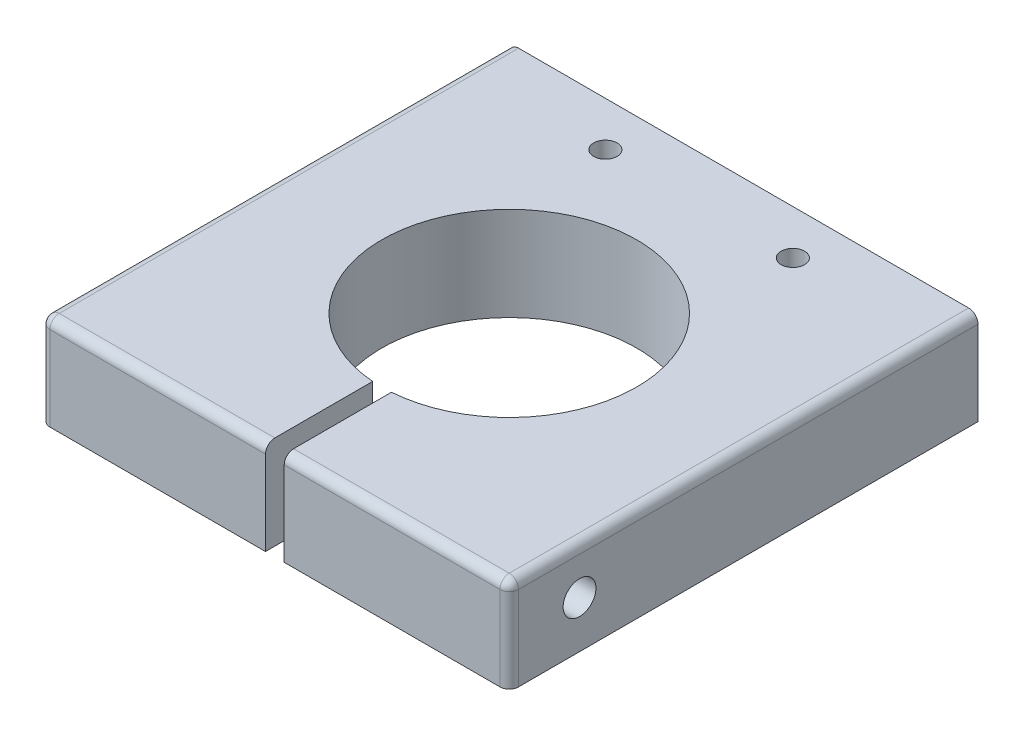
ISO-10303-21;
HEADER;
FILE_DESCRIPTION(('STEP AP214'),'2;1');
FILE_NAME('part.step','',(''),(''),'','','');
FILE_SCHEMA(('AUTOMOTIVE_DESIGN { 1 0 10303 214 1 1 1 1 }'));
ENDSEC;
DATA;
#1=APPLICATION_CONTEXT('core data for automotive mechanical design processes');
#2=APPLICATION_PROTOCOL_DEFINITION('international standard','automotive_design',2000,#1);
#3=PRODUCT_CONTEXT('',#1,'mechanical');
#4=PRODUCT('Part','Part','',(#3));
#5=PRODUCT_RELATED_PRODUCT_CATEGORY('part','',(#4));
#6=PRODUCT_DEFINITION_FORMATION('','',#4);
#7=PRODUCT_DEFINITION_CONTEXT('part definition',#1,'design');
#8=PRODUCT_DEFINITION('design','',#6,#7);
#9=PRODUCT_DEFINITION_SHAPE('','',#8);
#10=(LENGTH_UNIT() NAMED_UNIT(*) SI_UNIT(.MILLI.,.METRE.));
#11=(NAMED_UNIT(*) PLANE_ANGLE_UNIT() SI_UNIT($,.RADIAN.));
#12=(NAMED_UNIT(*) SI_UNIT($,.STERADIAN.) SOLID_ANGLE_UNIT());
#13=UNCERTAINTY_MEASURE_WITH_UNIT(LENGTH_MEASURE(1.E-05),#10,'distance_accuracy_value','');
#14=(GEOMETRIC_REPRESENTATION_CONTEXT(3) GLOBAL_UNCERTAINTY_ASSIGNED_CONTEXT((#13)) GLOBAL_UNIT_ASSIGNED_CONTEXT((#10,
#11,#12)) REPRESENTATION_CONTEXT('',''));
#15=CARTESIAN_POINT('',(0.,0.,0.));
#16=DIRECTION('',(0.,0.,1.));
#17=DIRECTION('',(1.,0.,0.));
#18=AXIS2_PLACEMENT_3D('',#15,#16,#17);
#19=CARTESIAN_POINT('',(2.00000000000002,20.,100.));
#20=DIRECTION('',(1.,0.,0.));
#21=DIRECTION('',(0.,0.,-1.));
#22=AXIS2_PLACEMENT_3D('',#19,#20,#21);
#23=PLANE('',#22);
#24=CARTESIAN_POINT('',(2.00000000000002,10.,85.));
#25=DIRECTION('',(1.,0.,0.));
#26=DIRECTION('',(0.,0.,-1.));
#27=AXIS2_PLACEMENT_3D('',#24,#25,#26);
#28=CIRCLE('',#27,3.50000000000002);
#29=CARTESIAN_POINT('',(2.00000000000002,10.,81.5));
#30=VERTEX_POINT('',#29);
#31=EDGE_CURVE('E179',#30,#30,#28,.T.);
#32=ORIENTED_EDGE('',*,*,#31,.T.);
#33=EDGE_LOOP('',(#32));
#34=FACE_BOUND('',#33,.T.);
#35=DIRECTION('',(0.,-1.,0.));
#36=VECTOR('',#35,1.);
#37=CARTESIAN_POINT('',(2.00000000000002,20.,100.));
#38=LINE('',#37,#36);
#39=CARTESIAN_POINT('',(2.00000000000002,18.,100.));
#40=VERTEX_POINT('',#39);
#41=CARTESIAN_POINT('',(2.00000000000002,0.,100.));
#42=VERTEX_POINT('',#41);
#43=EDGE_CURVE('E171',#40,#42,#38,.T.);
#44=ORIENTED_EDGE('',*,*,#43,.F.);
#45=CARTESIAN_POINT('',(2.00000000000002,18.,98.));
#46=DIRECTION('',(1.,0.,0.));
#47=DIRECTION('',(0.,0.,-1.));
#48=AXIS2_PLACEMENT_3D('',#45,#46,#47);
#49=CIRCLE('',#48,2.);
#50=CARTESIAN_POINT('',(2.00000000000002,20.,98.));
#51=VERTEX_POINT('',#50);
#52=EDGE_CURVE('E42',#40,#51,#49,.F.);
#53=ORIENTED_EDGE('',*,*,#52,.T.);
#54=DIRECTION('',(0.,0.,1.));
#55=VECTOR('',#54,1.);
#56=CARTESIAN_POINT('',(2.00000000000002,20.,100.));
#57=LINE('',#56,#55);
#58=CARTESIAN_POINT('',(2.00000000000002,20.,77.1263709330976));
#59=VERTEX_POINT('',#58);
#60=EDGE_CURVE('E144',#59,#51,#57,.T.);
#61=ORIENTED_EDGE('',*,*,#60,.F.);
#62=DIRECTION('',(0.,1.,0.));
#63=VECTOR('',#62,1.);
#64=CARTESIAN_POINT('',(2.00000000000002,0.,77.1263709330976));
#65=LINE('',#64,#63);
#66=CARTESIAN_POINT('',(2.00000000000002,0.,77.1263709330976));
#67=VERTEX_POINT('',#66);
#68=EDGE_CURVE('E129',#59,#67,#65,.F.);
#69=ORIENTED_EDGE('',*,*,#68,.T.);
#70=DIRECTION('',(0.,0.,1.));
#71=VECTOR('',#70,1.);
#72=CARTESIAN_POINT('',(2.00000000000002,0.,100.));
#73=LINE('',#72,#71);
#74=EDGE_CURVE('E163',#67,#42,#73,.T.);
#75=ORIENTED_EDGE('',*,*,#74,.T.);
#76=EDGE_LOOP('',(#44,#53,#61,#69,#75));
#77=FACE_BOUND('',#76,.T.);
#78=ADVANCED_FACE('F33',(#34,#77),#23,.F.);
#79=CARTESIAN_POINT('',(50.,20.,100.));
#80=DIRECTION('',(0.,0.,-1.));
#81=DIRECTION('',(-1.,0.,0.));
#82=AXIS2_PLACEMENT_3D('',#79,#80,#81);
#83=PLANE('',#82);
#84=DIRECTION('',(1.,0.,0.));
#85=VECTOR('',#84,1.);
#86=CARTESIAN_POINT('',(50.,0.,100.));
#87=LINE('',#86,#85);
#88=CARTESIAN_POINT('',(48.,0.,100.));
#89=VERTEX_POINT('',#88);
#90=EDGE_CURVE('E165',#42,#89,#87,.T.);
#91=ORIENTED_EDGE('',*,*,#90,.T.);
#92=DIRECTION('',(0.,-1.,0.));
#93=VECTOR('',#92,1.);
#94=CARTESIAN_POINT('',(48.,20.,100.));
#95=LINE('',#94,#93);
#96=CARTESIAN_POINT('',(48.,18.,100.));
#97=VERTEX_POINT('',#96);
#98=EDGE_CURVE('E191',#89,#97,#95,.F.);
#99=ORIENTED_EDGE('',*,*,#98,.T.);
#100=DIRECTION('',(1.,0.,0.));
#101=VECTOR('',#100,1.);
#102=CARTESIAN_POINT('',(50.,18.,100.));
#103=LINE('',#102,#101);
#104=EDGE_CURVE('E189',#97,#40,#103,.F.);
#105=ORIENTED_EDGE('',*,*,#104,.T.);
#106=ORIENTED_EDGE('',*,*,#43,.T.);
#107=EDGE_LOOP('',(#91,#99,#105,#106));
#108=FACE_BOUND('',#107,.T.);
#109=ADVANCED_FACE('F300',(#108),#83,.F.);
#110=CARTESIAN_POINT('',(50.,20.,0.));
#111=DIRECTION('',(-1.,0.,0.));
#112=DIRECTION('',(0.,0.,1.));
#113=AXIS2_PLACEMENT_3D('',#110,#111,#112);
#114=PLANE('',#113);
#115=CARTESIAN_POINT('',(50.,10.,85.));
#116=DIRECTION('',(1.,0.,0.));
#117=DIRECTION('',(0.,0.,-1.));
#118=AXIS2_PLACEMENT_3D('',#115,#116,#117);
#119=CIRCLE('',#118,3.50000000000002);
#120=CARTESIAN_POINT('',(50.,10.,81.5));
#121=VERTEX_POINT('',#120);
#122=EDGE_CURVE('E222',#121,#121,#119,.T.);
#123=ORIENTED_EDGE('',*,*,#122,.F.);
#124=EDGE_LOOP('',(#123));
#125=FACE_BOUND('',#124,.T.);
#126=DIRECTION('',(0.,0.,-1.));
#127=VECTOR('',#126,1.);
#128=CARTESIAN_POINT('',(50.,18.,0.));
#129=LINE('',#128,#127);
#130=CARTESIAN_POINT('',(50.,18.,0.));
#131=VERTEX_POINT('',#130);
#132=CARTESIAN_POINT('',(50.,18.,98.));
#133=VERTEX_POINT('',#132);
#134=EDGE_CURVE('E175',#131,#133,#129,.F.);
#135=ORIENTED_EDGE('',*,*,#134,.T.);
#136=DIRECTION('',(0.,-1.,0.));
#137=VECTOR('',#136,1.);
#138=CARTESIAN_POINT('',(50.,20.,98.));
#139=LINE('',#138,#137);
#140=CARTESIAN_POINT('',(50.,0.,98.));
#141=VERTEX_POINT('',#140);
#142=EDGE_CURVE('E182',#133,#141,#139,.T.);
#143=ORIENTED_EDGE('',*,*,#142,.T.);
#144=DIRECTION('',(0.,0.,-1.));
#145=VECTOR('',#144,1.);
#146=CARTESIAN_POINT('',(50.,0.,0.));
#147=LINE('',#146,#145);
#148=CARTESIAN_POINT('',(50.,0.,0.));
#149=VERTEX_POINT('',#148);
#150=EDGE_CURVE('E157',#141,#149,#147,.T.);
#151=ORIENTED_EDGE('',*,*,#150,.T.);
#152=DIRECTION('',(0.,-1.,0.));
#153=VECTOR('',#152,1.);
#154=CARTESIAN_POINT('',(50.,20.,0.));
#155=LINE('',#154,#153);
#156=EDGE_CURVE('E154',#131,#149,#155,.T.);
#157=ORIENTED_EDGE('',*,*,#156,.F.);
#158=EDGE_LOOP('',(#135,#143,#151,#157));
#159=FACE_BOUND('',#158,.T.);
#160=ADVANCED_FACE('F306',(#125,#159),#114,.F.);
#161=CARTESIAN_POINT('',(0.,20.,0.));
#162=DIRECTION('',(0.,0.,1.));
#163=DIRECTION('',(1.,0.,0.));
#164=AXIS2_PLACEMENT_3D('',#161,#162,#163);
#165=PLANE('',#164);
#166=DIRECTION('',(-1.,0.,0.));
#167=VECTOR('',#166,1.);
#168=CARTESIAN_POINT('',(0.,20.,0.));
#169=LINE('',#168,#167);
#170=CARTESIAN_POINT('',(48.,20.,0.));
#171=VERTEX_POINT('',#170);
#172=CARTESIAN_POINT('',(-48.,20.,0.));
#173=VERTEX_POINT('',#172);
#174=EDGE_CURVE('E151',#171,#173,#169,.T.);
#175=ORIENTED_EDGE('',*,*,#174,.F.);
#176=CARTESIAN_POINT('',(48.,18.,0.));
#177=DIRECTION('',(0.,0.,1.));
#178=DIRECTION('',(1.,0.,0.));
#179=AXIS2_PLACEMENT_3D('',#176,#177,#178);
#180=CIRCLE('',#179,2.);
#181=EDGE_CURVE('E210',#171,#131,#180,.F.);
#182=ORIENTED_EDGE('',*,*,#181,.T.);
#183=ORIENTED_EDGE('',*,*,#156,.T.);
#184=DIRECTION('',(-1.,0.,0.));
#185=VECTOR('',#184,1.);
#186=CARTESIAN_POINT('',(0.,0.,0.));
#187=LINE('',#186,#185);
#188=CARTESIAN_POINT('',(-50.,0.,0.));
#189=VERTEX_POINT('',#188);
#190=EDGE_CURVE('E152',#149,#189,#187,.T.);
#191=ORIENTED_EDGE('',*,*,#190,.T.);
#192=DIRECTION('',(0.,-1.,0.));
#193=VECTOR('',#192,1.);
#194=CARTESIAN_POINT('',(-50.,20.,0.));
#195=LINE('',#194,#193);
#196=CARTESIAN_POINT('',(-50.,18.,0.));
#197=VERTEX_POINT('',#196);
#198=EDGE_CURVE('E160',#197,#189,#195,.T.);
#199=ORIENTED_EDGE('',*,*,#198,.F.);
#200=CARTESIAN_POINT('',(-48.,18.,0.));
#201=DIRECTION('',(0.,0.,1.));
#202=DIRECTION('',(1.,0.,0.));
#203=AXIS2_PLACEMENT_3D('',#200,#201,#202);
#204=CIRCLE('',#203,2.);
#205=EDGE_CURVE('E208',#197,#173,#204,.F.);
#206=ORIENTED_EDGE('',*,*,#205,.T.);
#207=EDGE_LOOP('',(#175,#182,#183,#191,#199,#206));
#208=FACE_BOUND('',#207,.T.);
#209=ADVANCED_FACE('F352',(#208),#165,.F.);
#210=CARTESIAN_POINT('',(0.,20.,0.));
#211=DIRECTION('',(0.,-1.,0.));
#212=DIRECTION('',(0.,0.,-1.));
#213=AXIS2_PLACEMENT_3D('',#210,#211,#212);
#214=PLANE('',#213);
#215=CARTESIAN_POINT('',(-20.,20.,9.50000000000001));
#216=DIRECTION('',(0.,-1.,0.));
#217=DIRECTION('',(0.,0.,1.));
#218=AXIS2_PLACEMENT_3D('',#215,#216,#217);
#219=CIRCLE('',#218,2.5);
#220=CARTESIAN_POINT('',(-20.,20.,12.));
#221=VERTEX_POINT('',#220);
#222=EDGE_CURVE('E269',#221,#221,#219,.T.);
#223=ORIENTED_EDGE('',*,*,#222,.T.);
#224=EDGE_LOOP('',(#223));
#225=FACE_BOUND('',#224,.T.);
#226=CARTESIAN_POINT('',(20.,20.,9.50000000000001));
#227=DIRECTION('',(0.,1.,0.));
#228=DIRECTION('',(0.,0.,1.));
#229=AXIS2_PLACEMENT_3D('',#226,#227,#228);
#230=CIRCLE('',#229,2.5);
#231=CARTESIAN_POINT('',(20.,20.,12.));
#232=VERTEX_POINT('',#231);
#233=EDGE_CURVE('E263',#232,#232,#230,.T.);
#234=ORIENTED_EDGE('',*,*,#233,.F.);
#235=EDGE_LOOP('',(#234));
#236=FACE_BOUND('',#235,.T.);
#237=DIRECTION('',(1.,0.,0.));
#238=VECTOR('',#237,1.);
#239=CARTESIAN_POINT('',(0.,20.,98.));
#240=LINE('',#239,#238);
#241=CARTESIAN_POINT('',(48.,20.,98.));
#242=VERTEX_POINT('',#241);
#243=EDGE_CURVE('E50',#51,#242,#240,.T.);
#244=ORIENTED_EDGE('',*,*,#243,.T.);
#245=DIRECTION('',(0.,0.,-1.));
#246=VECTOR('',#245,1.);
#247=CARTESIAN_POINT('',(48.,20.,0.));
#248=LINE('',#247,#246);
#249=EDGE_CURVE('E206',#242,#171,#248,.T.);
#250=ORIENTED_EDGE('',*,*,#249,.T.);
#251=ORIENTED_EDGE('',*,*,#174,.T.);
#252=DIRECTION('',(0.,0.,-1.));
#253=VECTOR('',#252,1.);
#254=CARTESIAN_POINT('',(-48.,20.,100.));
#255=LINE('',#254,#253);
#256=CARTESIAN_POINT('',(-48.,20.,98.));
#257=VERTEX_POINT('',#256);
#258=EDGE_CURVE('E57',#173,#257,#255,.F.);
#259=ORIENTED_EDGE('',*,*,#258,.T.);
#260=DIRECTION('',(-1.,0.,0.));
#261=VECTOR('',#260,1.);
#262=CARTESIAN_POINT('',(-2.00000000000002,20.,98.));
#263=LINE('',#262,#261);
#264=CARTESIAN_POINT('',(-2.00000000000002,20.,98.));
#265=VERTEX_POINT('',#264);
#266=EDGE_CURVE('E202',#257,#265,#263,.F.);
#267=ORIENTED_EDGE('',*,*,#266,.T.);
#268=DIRECTION('',(0.,0.,1.));
#269=VECTOR('',#268,1.);
#270=CARTESIAN_POINT('',(-2.00000000000002,20.,100.));
#271=LINE('',#270,#269);
#272=CARTESIAN_POINT('',(-2.00000000000002,20.,77.1263709330976));
#273=VERTEX_POINT('',#272);
#274=EDGE_CURVE('E146',#273,#265,#271,.T.);
#275=ORIENTED_EDGE('',*,*,#274,.F.);
#276=CARTESIAN_POINT('',(0.,20.,50.));
#277=DIRECTION('',(0.,1.,0.));
#278=DIRECTION('',(0.,0.,1.));
#279=AXIS2_PLACEMENT_3D('',#276,#277,#278);
#280=CIRCLE('',#279,27.2);
#281=EDGE_CURVE('E132',#59,#273,#280,.T.);
#282=ORIENTED_EDGE('',*,*,#281,.F.);
#283=ORIENTED_EDGE('',*,*,#60,.T.);
#284=EDGE_LOOP('',(#244,#250,#251,#259,#267,#275,#282,#283));
#285=FACE_BOUND('',#284,.T.);
#286=ADVANCED_FACE('F143',(#225,#236,#285),#214,.F.);
#287=CARTESIAN_POINT('',(0.,0.,0.));
#288=DIRECTION('',(0.,-1.,0.));
#289=DIRECTION('',(0.,0.,-1.));
#290=AXIS2_PLACEMENT_3D('',#287,#288,#289);
#291=PLANE('',#290);
#292=CARTESIAN_POINT('',(-20.,0.,9.50000000000001));
#293=DIRECTION('',(0.,-1.,0.));
#294=DIRECTION('',(0.,0.,1.));
#295=AXIS2_PLACEMENT_3D('',#292,#293,#294);
#296=CIRCLE('',#295,2.5);
#297=CARTESIAN_POINT('',(-20.,0.,12.));
#298=VERTEX_POINT('',#297);
#299=EDGE_CURVE('E266',#298,#298,#296,.T.);
#300=ORIENTED_EDGE('',*,*,#299,.F.);
#301=EDGE_LOOP('',(#300));
#302=FACE_BOUND('',#301,.T.);
#303=CARTESIAN_POINT('',(20.,0.,9.50000000000001));
#304=DIRECTION('',(0.,1.,0.));
#305=DIRECTION('',(0.,0.,1.));
#306=AXIS2_PLACEMENT_3D('',#303,#304,#305);
#307=CIRCLE('',#306,2.5);
#308=CARTESIAN_POINT('',(20.,0.,12.));
#309=VERTEX_POINT('',#308);
#310=EDGE_CURVE('E147',#309,#309,#307,.T.);
#311=ORIENTED_EDGE('',*,*,#310,.T.);
#312=EDGE_LOOP('',(#311));
#313=FACE_BOUND('',#312,.T.);
#314=ORIENTED_EDGE('',*,*,#150,.F.);
#315=CARTESIAN_POINT('',(48.,0.,98.));
#316=DIRECTION('',(0.,-1.,0.));
#317=DIRECTION('',(0.,0.,-1.));
#318=AXIS2_PLACEMENT_3D('',#315,#316,#317);
#319=CIRCLE('',#318,2.);
#320=EDGE_CURVE('E187',#141,#89,#319,.T.);
#321=ORIENTED_EDGE('',*,*,#320,.T.);
#322=ORIENTED_EDGE('',*,*,#90,.F.);
#323=ORIENTED_EDGE('',*,*,#74,.F.);
#324=CARTESIAN_POINT('',(0.,0.,50.));
#325=DIRECTION('',(0.,1.,0.));
#326=DIRECTION('',(0.,0.,1.));
#327=AXIS2_PLACEMENT_3D('',#324,#325,#326);
#328=CIRCLE('',#327,27.2);
#329=CARTESIAN_POINT('',(-2.00000000000002,0.,77.1263709330976));
#330=VERTEX_POINT('',#329);
#331=EDGE_CURVE('E135',#67,#330,#328,.T.);
#332=ORIENTED_EDGE('',*,*,#331,.T.);
#333=DIRECTION('',(0.,0.,1.));
#334=VECTOR('',#333,1.);
#335=CARTESIAN_POINT('',(-2.00000000000002,0.,100.));
#336=LINE('',#335,#334);
#337=CARTESIAN_POINT('',(-2.00000000000002,0.,100.));
#338=VERTEX_POINT('',#337);
#339=EDGE_CURVE('E253',#330,#338,#336,.T.);
#340=ORIENTED_EDGE('',*,*,#339,.T.);
#341=DIRECTION('',(-1.,0.,0.));
#342=VECTOR('',#341,1.);
#343=CARTESIAN_POINT('',(-50.,0.,100.));
#344=LINE('',#343,#342);
#345=CARTESIAN_POINT('',(-48.,0.,100.));
#346=VERTEX_POINT('',#345);
#347=EDGE_CURVE('E244',#338,#346,#344,.T.);
#348=ORIENTED_EDGE('',*,*,#347,.T.);
#349=CARTESIAN_POINT('',(-48.,0.,98.));
#350=DIRECTION('',(0.,-1.,0.));
#351=DIRECTION('',(0.,0.,-1.));
#352=AXIS2_PLACEMENT_3D('',#349,#350,#351);
#353=CIRCLE('',#352,2.);
#354=CARTESIAN_POINT('',(-50.,0.,98.));
#355=VERTEX_POINT('',#354);
#356=EDGE_CURVE('E185',#346,#355,#353,.T.);
#357=ORIENTED_EDGE('',*,*,#356,.T.);
#358=DIRECTION('',(0.,0.,-1.));
#359=VECTOR('',#358,1.);
#360=CARTESIAN_POINT('',(-50.,0.,0.));
#361=LINE('',#360,#359);
#362=EDGE_CURVE('E140',#355,#189,#361,.T.);
#363=ORIENTED_EDGE('',*,*,#362,.T.);
#364=ORIENTED_EDGE('',*,*,#190,.F.);
#365=EDGE_LOOP('',(#314,#321,#322,#323,#332,#340,#348,#357,#363,#364));
#366=FACE_BOUND('',#365,.T.);
#367=ADVANCED_FACE('F249',(#302,#313,#366),#291,.T.);
#368=CARTESIAN_POINT('',(-50.,20.,0.));
#369=DIRECTION('',(-1.,0.,0.));
#370=DIRECTION('',(0.,0.,1.));
#371=AXIS2_PLACEMENT_3D('',#368,#369,#370);
#372=PLANE('',#371);
#373=CARTESIAN_POINT('',(-50.,10.,85.));
#374=DIRECTION('',(1.,0.,0.));
#375=DIRECTION('',(0.,0.,-1.));
#376=AXIS2_PLACEMENT_3D('',#373,#374,#375);
#377=CIRCLE('',#376,3.50000000000002);
#378=CARTESIAN_POINT('',(-50.,10.,81.5));
#379=VERTEX_POINT('',#378);
#380=EDGE_CURVE('E180',#379,#379,#377,.T.);
#381=ORIENTED_EDGE('',*,*,#380,.T.);
#382=EDGE_LOOP('',(#381));
#383=FACE_BOUND('',#382,.T.);
#384=ORIENTED_EDGE('',*,*,#362,.F.);
#385=DIRECTION('',(0.,-1.,0.));
#386=VECTOR('',#385,1.);
#387=CARTESIAN_POINT('',(-50.,20.,98.));
#388=LINE('',#387,#386);
#389=CARTESIAN_POINT('',(-50.,18.,98.));
#390=VERTEX_POINT('',#389);
#391=EDGE_CURVE('E200',#355,#390,#388,.F.);
#392=ORIENTED_EDGE('',*,*,#391,.T.);
#393=DIRECTION('',(0.,0.,-1.));
#394=VECTOR('',#393,1.);
#395=CARTESIAN_POINT('',(-50.,18.,0.));
#396=LINE('',#395,#394);
#397=EDGE_CURVE('E198',#390,#197,#396,.T.);
#398=ORIENTED_EDGE('',*,*,#397,.T.);
#399=ORIENTED_EDGE('',*,*,#198,.T.);
#400=EDGE_LOOP('',(#384,#392,#398,#399));
#401=FACE_BOUND('',#400,.T.);
#402=ADVANCED_FACE('F281',(#383,#401),#372,.T.);
#403=CARTESIAN_POINT('',(-50.,20.,100.));
#404=DIRECTION('',(0.,0.,1.));
#405=DIRECTION('',(1.,0.,0.));
#406=AXIS2_PLACEMENT_3D('',#403,#404,#405);
#407=PLANE('',#406);
#408=DIRECTION('',(-1.,0.,0.));
#409=VECTOR('',#408,1.);
#410=CARTESIAN_POINT('',(-50.,18.,100.));
#411=LINE('',#410,#409);
#412=CARTESIAN_POINT('',(-2.00000000000002,18.,100.));
#413=VERTEX_POINT('',#412);
#414=CARTESIAN_POINT('',(-48.,18.,100.));
#415=VERTEX_POINT('',#414);
#416=EDGE_CURVE('E193',#413,#415,#411,.T.);
#417=ORIENTED_EDGE('',*,*,#416,.T.);
#418=DIRECTION('',(0.,-1.,0.));
#419=VECTOR('',#418,1.);
#420=CARTESIAN_POINT('',(-48.,20.,100.));
#421=LINE('',#420,#419);
#422=EDGE_CURVE('E195',#415,#346,#421,.T.);
#423=ORIENTED_EDGE('',*,*,#422,.T.);
#424=ORIENTED_EDGE('',*,*,#347,.F.);
#425=DIRECTION('',(0.,-1.,0.));
#426=VECTOR('',#425,1.);
#427=CARTESIAN_POINT('',(-2.00000000000002,20.,100.));
#428=LINE('',#427,#426);
#429=EDGE_CURVE('E258',#413,#338,#428,.T.);
#430=ORIENTED_EDGE('',*,*,#429,.F.);
#431=EDGE_LOOP('',(#417,#423,#424,#430));
#432=FACE_BOUND('',#431,.T.);
#433=ADVANCED_FACE('F242',(#432),#407,.T.);
#434=CARTESIAN_POINT('',(-2.00000000000002,20.,100.));
#435=DIRECTION('',(1.,0.,0.));
#436=DIRECTION('',(0.,0.,-1.));
#437=AXIS2_PLACEMENT_3D('',#434,#435,#436);
#438=PLANE('',#437);
#439=CARTESIAN_POINT('',(-2.00000000000002,10.,85.));
#440=DIRECTION('',(1.,0.,0.));
#441=DIRECTION('',(0.,0.,-1.));
#442=AXIS2_PLACEMENT_3D('',#439,#440,#441);
#443=CIRCLE('',#442,3.50000000000002);
#444=CARTESIAN_POINT('',(-2.00000000000002,10.,81.5));
#445=VERTEX_POINT('',#444);
#446=EDGE_CURVE('E176',#445,#445,#443,.T.);
#447=ORIENTED_EDGE('',*,*,#446,.F.);
#448=EDGE_LOOP('',(#447));
#449=FACE_BOUND('',#448,.T.);
#450=ORIENTED_EDGE('',*,*,#274,.T.);
#451=CARTESIAN_POINT('',(-2.00000000000002,18.,98.));
#452=DIRECTION('',(1.,0.,0.));
#453=DIRECTION('',(0.,0.,-1.));
#454=AXIS2_PLACEMENT_3D('',#451,#452,#453);
#455=CIRCLE('',#454,2.);
#456=EDGE_CURVE('E11',#265,#413,#455,.T.);
#457=ORIENTED_EDGE('',*,*,#456,.T.);
#458=ORIENTED_EDGE('',*,*,#429,.T.);
#459=ORIENTED_EDGE('',*,*,#339,.F.);
#460=DIRECTION('',(0.,1.,0.));
#461=VECTOR('',#460,1.);
#462=CARTESIAN_POINT('',(-2.00000000000002,0.,77.1263709330976));
#463=LINE('',#462,#461);
#464=EDGE_CURVE('E173',#273,#330,#463,.F.);
#465=ORIENTED_EDGE('',*,*,#464,.F.);
#466=EDGE_LOOP('',(#450,#457,#458,#459,#465));
#467=FACE_BOUND('',#466,.T.);
#468=ADVANCED_FACE('F335',(#449,#467),#438,.T.);
#469=CARTESIAN_POINT('',(0.,0.,50.));
#470=DIRECTION('',(0.,1.,0.));
#471=DIRECTION('',(0.,0.,1.));
#472=AXIS2_PLACEMENT_3D('',#469,#470,#471);
#473=CYLINDRICAL_SURFACE('',#472,27.2);
#474=ORIENTED_EDGE('',*,*,#281,.T.);
#475=ORIENTED_EDGE('',*,*,#464,.T.);
#476=ORIENTED_EDGE('',*,*,#331,.F.);
#477=ORIENTED_EDGE('',*,*,#68,.F.);
#478=EDGE_LOOP('',(#474,#475,#476,#477));
#479=FACE_BOUND('',#478,.T.);
#480=ADVANCED_FACE('F131',(#479),#473,.F.);
#481=CARTESIAN_POINT('',(20.,0.,9.50000000000001));
#482=DIRECTION('',(0.,1.,0.));
#483=DIRECTION('',(0.,0.,1.));
#484=AXIS2_PLACEMENT_3D('',#481,#482,#483);
#485=CYLINDRICAL_SURFACE('',#484,2.5);
#486=ORIENTED_EDGE('',*,*,#310,.F.);
#487=EDGE_LOOP('',(#486));
#488=FACE_BOUND('',#487,.T.);
#489=ORIENTED_EDGE('',*,*,#233,.T.);
#490=EDGE_LOOP('',(#489));
#491=FACE_BOUND('',#490,.T.);
#492=ADVANCED_FACE('F296',(#488,#491),#485,.F.);
#493=CARTESIAN_POINT('',(-20.,0.,9.50000000000001));
#494=DIRECTION('',(0.,1.,0.));
#495=DIRECTION('',(0.,0.,1.));
#496=AXIS2_PLACEMENT_3D('',#493,#494,#495);
#497=CYLINDRICAL_SURFACE('',#496,2.5);
#498=ORIENTED_EDGE('',*,*,#299,.T.);
#499=EDGE_LOOP('',(#498));
#500=FACE_BOUND('',#499,.T.);
#501=ORIENTED_EDGE('',*,*,#222,.F.);
#502=EDGE_LOOP('',(#501));
#503=FACE_BOUND('',#502,.T.);
#504=ADVANCED_FACE('F287',(#500,#503),#497,.F.);
#505=CARTESIAN_POINT('',(-50.,10.,85.));
#506=DIRECTION('',(1.,0.,0.));
#507=DIRECTION('',(0.,0.,-1.));
#508=AXIS2_PLACEMENT_3D('',#505,#506,#507);
#509=CYLINDRICAL_SURFACE('',#508,3.50000000000002);
#510=ORIENTED_EDGE('',*,*,#446,.T.);
#511=EDGE_LOOP('',(#510));
#512=FACE_BOUND('',#511,.T.);
#513=ORIENTED_EDGE('',*,*,#380,.F.);
#514=EDGE_LOOP('',(#513));
#515=FACE_BOUND('',#514,.T.);
#516=ADVANCED_FACE('F284',(#512,#515),#509,.F.);
#517=ORIENTED_EDGE('',*,*,#122,.T.);
#518=EDGE_LOOP('',(#517));
#519=FACE_BOUND('',#518,.T.);
#520=ORIENTED_EDGE('',*,*,#31,.F.);
#521=EDGE_LOOP('',(#520));
#522=FACE_BOUND('',#521,.T.);
#523=ADVANCED_FACE('F286',(#519,#522),#509,.F.);
#524=CARTESIAN_POINT('',(0.,18.,98.));
#525=DIRECTION('',(1.,0.,0.));
#526=DIRECTION('',(0.,0.,-1.));
#527=AXIS2_PLACEMENT_3D('',#524,#525,#526);
#528=CYLINDRICAL_SURFACE('',#527,2.);
#529=ORIENTED_EDGE('',*,*,#52,.F.);
#530=ORIENTED_EDGE('',*,*,#104,.F.);
#531=CARTESIAN_POINT('',(48.,18.,98.));
#532=DIRECTION('',(1.,0.,0.));
#533=DIRECTION('',(0.,0.,-1.));
#534=AXIS2_PLACEMENT_3D('',#531,#532,#533);
#535=CIRCLE('',#534,2.);
#536=EDGE_CURVE('E219',#242,#97,#535,.T.);
#537=ORIENTED_EDGE('',*,*,#536,.F.);
#538=ORIENTED_EDGE('',*,*,#243,.F.);
#539=EDGE_LOOP('',(#529,#530,#537,#538));
#540=FACE_BOUND('',#539,.T.);
#541=ADVANCED_FACE('F294',(#540),#528,.T.);
#542=CARTESIAN_POINT('',(48.,18.,0.));
#543=DIRECTION('',(0.,0.,-1.));
#544=DIRECTION('',(-1.,0.,0.));
#545=AXIS2_PLACEMENT_3D('',#542,#543,#544);
#546=CYLINDRICAL_SURFACE('',#545,2.);
#547=ORIENTED_EDGE('',*,*,#181,.F.);
#548=ORIENTED_EDGE('',*,*,#249,.F.);
#549=CARTESIAN_POINT('',(48.,18.,98.));
#550=DIRECTION('',(0.,0.,1.));
#551=DIRECTION('',(1.,0.,0.));
#552=AXIS2_PLACEMENT_3D('',#549,#550,#551);
#553=CIRCLE('',#552,2.);
#554=EDGE_CURVE('E216',#133,#242,#553,.T.);
#555=ORIENTED_EDGE('',*,*,#554,.F.);
#556=ORIENTED_EDGE('',*,*,#134,.F.);
#557=EDGE_LOOP('',(#547,#548,#555,#556));
#558=FACE_BOUND('',#557,.T.);
#559=ADVANCED_FACE('F318',(#558),#546,.T.);
#560=CARTESIAN_POINT('',(48.,18.,98.));
#561=DIRECTION('',(0.,0.,1.));
#562=DIRECTION('',(1.,0.,0.));
#563=AXIS2_PLACEMENT_3D('',#560,#561,#562);
#564=SPHERICAL_SURFACE('',#563,2.);
#565=ORIENTED_EDGE('',*,*,#554,.T.);
#566=ORIENTED_EDGE('',*,*,#536,.T.);
#567=CARTESIAN_POINT('',(48.,18.,98.));
#568=DIRECTION('',(0.,1.,0.));
#569=DIRECTION('',(0.,0.,1.));
#570=AXIS2_PLACEMENT_3D('',#567,#568,#569);
#571=CIRCLE('',#570,2.);
#572=EDGE_CURVE('E213',#133,#97,#571,.F.);
#573=ORIENTED_EDGE('',*,*,#572,.F.);
#574=EDGE_LOOP('',(#565,#566,#573));
#575=FACE_BOUND('',#574,.T.);
#576=ADVANCED_FACE('F314',(#575),#564,.T.);
#577=CARTESIAN_POINT('',(48.,20.,98.));
#578=DIRECTION('',(0.,-1.,0.));
#579=DIRECTION('',(0.,0.,-1.));
#580=AXIS2_PLACEMENT_3D('',#577,#578,#579);
#581=CYLINDRICAL_SURFACE('',#580,2.);
#582=ORIENTED_EDGE('',*,*,#572,.T.);
#583=ORIENTED_EDGE('',*,*,#98,.F.);
#584=ORIENTED_EDGE('',*,*,#320,.F.);
#585=ORIENTED_EDGE('',*,*,#142,.F.);
#586=EDGE_LOOP('',(#582,#583,#584,#585));
#587=FACE_BOUND('',#586,.T.);
#588=ADVANCED_FACE('F311',(#587),#581,.T.);
#589=CARTESIAN_POINT('',(-48.,18.,0.));
#590=DIRECTION('',(0.,0.,1.));
#591=DIRECTION('',(1.,0.,0.));
#592=AXIS2_PLACEMENT_3D('',#589,#590,#591);
#593=CYLINDRICAL_SURFACE('',#592,2.);
#594=ORIENTED_EDGE('',*,*,#205,.F.);
#595=ORIENTED_EDGE('',*,*,#397,.F.);
#596=CARTESIAN_POINT('',(-48.,18.,98.));
#597=DIRECTION('',(0.,0.,1.));
#598=DIRECTION('',(1.,0.,0.));
#599=AXIS2_PLACEMENT_3D('',#596,#597,#598);
#600=CIRCLE('',#599,2.);
#601=EDGE_CURVE('E37',#257,#390,#600,.T.);
#602=ORIENTED_EDGE('',*,*,#601,.F.);
#603=ORIENTED_EDGE('',*,*,#258,.F.);
#604=EDGE_LOOP('',(#594,#595,#602,#603));
#605=FACE_BOUND('',#604,.T.);
#606=ADVANCED_FACE('F35',(#605),#593,.T.);
#607=CARTESIAN_POINT('',(-50.,18.,98.));
#608=DIRECTION('',(1.,0.,0.));
#609=DIRECTION('',(0.,0.,-1.));
#610=AXIS2_PLACEMENT_3D('',#607,#608,#609);
#611=CYLINDRICAL_SURFACE('',#610,2.);
#612=ORIENTED_EDGE('',*,*,#456,.F.);
#613=ORIENTED_EDGE('',*,*,#266,.F.);
#614=CARTESIAN_POINT('',(-48.,18.,98.));
#615=DIRECTION('',(-1.,0.,0.));
#616=DIRECTION('',(0.,0.,1.));
#617=AXIS2_PLACEMENT_3D('',#614,#615,#616);
#618=CIRCLE('',#617,2.);
#619=EDGE_CURVE('E225',#415,#257,#618,.T.);
#620=ORIENTED_EDGE('',*,*,#619,.F.);
#621=ORIENTED_EDGE('',*,*,#416,.F.);
#622=EDGE_LOOP('',(#612,#613,#620,#621));
#623=FACE_BOUND('',#622,.T.);
#624=ADVANCED_FACE('F329',(#623),#611,.T.);
#625=CARTESIAN_POINT('',(-48.,18.,98.));
#626=DIRECTION('',(0.,0.,1.));
#627=DIRECTION('',(1.,0.,0.));
#628=AXIS2_PLACEMENT_3D('',#625,#626,#627);
#629=SPHERICAL_SURFACE('',#628,2.);
#630=ORIENTED_EDGE('',*,*,#619,.T.);
#631=ORIENTED_EDGE('',*,*,#601,.T.);
#632=CARTESIAN_POINT('',(-48.,18.,98.));
#633=DIRECTION('',(0.,1.,0.));
#634=DIRECTION('',(0.,0.,1.));
#635=AXIS2_PLACEMENT_3D('',#632,#633,#634);
#636=CIRCLE('',#635,2.);
#637=EDGE_CURVE('E223',#415,#390,#636,.F.);
#638=ORIENTED_EDGE('',*,*,#637,.F.);
#639=EDGE_LOOP('',(#630,#631,#638));
#640=FACE_BOUND('',#639,.T.);
#641=ADVANCED_FACE('F232',(#640),#629,.T.);
#642=CARTESIAN_POINT('',(-48.,20.,98.));
#643=DIRECTION('',(0.,-1.,0.));
#644=DIRECTION('',(0.,0.,-1.));
#645=AXIS2_PLACEMENT_3D('',#642,#643,#644);
#646=CYLINDRICAL_SURFACE('',#645,2.);
#647=ORIENTED_EDGE('',*,*,#637,.T.);
#648=ORIENTED_EDGE('',*,*,#391,.F.);
#649=ORIENTED_EDGE('',*,*,#356,.F.);
#650=ORIENTED_EDGE('',*,*,#422,.F.);
#651=EDGE_LOOP('',(#647,#648,#649,#650));
#652=FACE_BOUND('',#651,.T.);
#653=ADVANCED_FACE('F238',(#652),#646,.T.);
#654=CLOSED_SHELL('',(#78,#109,#160,#209,#286,#367,#402,#433,#468,#480,#492,#504,#516,#523,#541,
#559,#576,#588,#606,#624,#641,#653));
#655=MANIFOLD_SOLID_BREP('B2',#654);
#656=ADVANCED_BREP_SHAPE_REPRESENTATION('',(#18,#655),#14);
#657=SHAPE_DEFINITION_REPRESENTATION(#9,#656);
ENDSEC;
END-ISO-10303-21;
